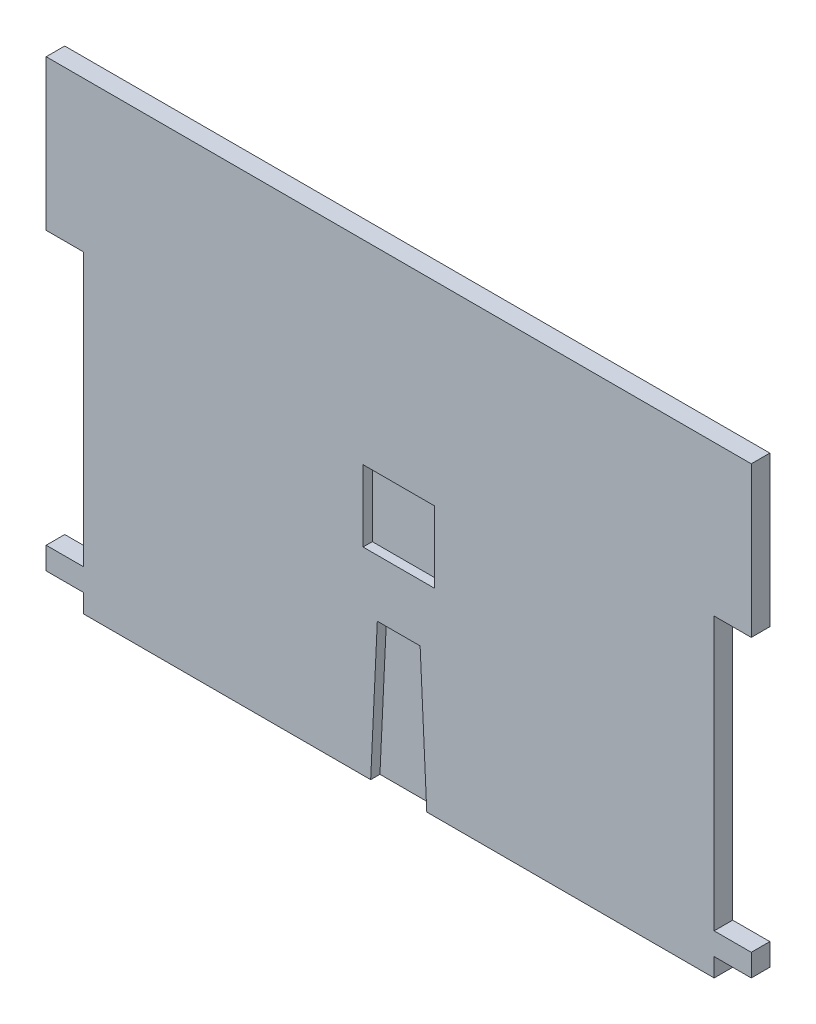
ISO-10303-21;
HEADER;
FILE_DESCRIPTION(('STEP AP214'),'2;1');
FILE_NAME('part.step','',(''),(''),'','','');
FILE_SCHEMA(('AUTOMOTIVE_DESIGN { 1 0 10303 214 1 1 1 1 }'));
ENDSEC;
DATA;
#1=APPLICATION_CONTEXT('core data for automotive mechanical design processes');
#2=APPLICATION_PROTOCOL_DEFINITION('international standard','automotive_design',2000,#1);
#3=PRODUCT_CONTEXT('',#1,'mechanical');
#4=PRODUCT('Part','Part','',(#3));
#5=PRODUCT_RELATED_PRODUCT_CATEGORY('part','',(#4));
#6=PRODUCT_DEFINITION_FORMATION('','',#4);
#7=PRODUCT_DEFINITION_CONTEXT('part definition',#1,'design');
#8=PRODUCT_DEFINITION('design','',#6,#7);
#9=PRODUCT_DEFINITION_SHAPE('','',#8);
#10=(LENGTH_UNIT() NAMED_UNIT(*) SI_UNIT(.MILLI.,.METRE.));
#11=(NAMED_UNIT(*) PLANE_ANGLE_UNIT() SI_UNIT($,.RADIAN.));
#12=(NAMED_UNIT(*) SI_UNIT($,.STERADIAN.) SOLID_ANGLE_UNIT());
#13=UNCERTAINTY_MEASURE_WITH_UNIT(LENGTH_MEASURE(1.E-05),#10,'distance_accuracy_value','');
#14=(GEOMETRIC_REPRESENTATION_CONTEXT(3) GLOBAL_UNCERTAINTY_ASSIGNED_CONTEXT((#13)) GLOBAL_UNIT_ASSIGNED_CONTEXT((#10,
#11,#12)) REPRESENTATION_CONTEXT('',''));
#15=CARTESIAN_POINT('',(0.,0.,0.));
#16=DIRECTION('',(0.,0.,1.));
#17=DIRECTION('',(1.,0.,0.));
#18=AXIS2_PLACEMENT_3D('',#15,#16,#17);
#19=CARTESIAN_POINT('',(-17.,0.5,1.));
#20=DIRECTION('',(0.,1.,0.));
#21=DIRECTION('',(0.,0.,1.));
#22=AXIS2_PLACEMENT_3D('',#19,#20,#21);
#23=PLANE('',#22);
#24=DIRECTION('',(0.,0.,1.));
#25=VECTOR('',#24,1.);
#26=CARTESIAN_POINT('',(1.51198727417339,0.5,1.));
#27=LINE('',#26,#25);
#28=CARTESIAN_POINT('',(1.51198727417339,0.5,0.5));
#29=VERTEX_POINT('',#28);
#30=CARTESIAN_POINT('',(1.51198727417339,0.5,1.));
#31=VERTEX_POINT('',#30);
#32=EDGE_CURVE('E11',#29,#31,#27,.T.);
#33=ORIENTED_EDGE('',*,*,#32,.F.);
#34=DIRECTION('',(-1.,0.,0.));
#35=VECTOR('',#34,1.);
#36=CARTESIAN_POINT('',(-17.,0.5,0.5));
#37=LINE('',#36,#35);
#38=CARTESIAN_POINT('',(-1.51198727417339,0.5,0.5));
#39=VERTEX_POINT('',#38);
#40=EDGE_CURVE('E223',#29,#39,#37,.T.);
#41=ORIENTED_EDGE('',*,*,#40,.T.);
#42=DIRECTION('',(0.,0.,-1.));
#43=VECTOR('',#42,1.);
#44=CARTESIAN_POINT('',(-1.51198727417339,0.5,1.));
#45=LINE('',#44,#43);
#46=CARTESIAN_POINT('',(-1.51198727417339,0.5,1.));
#47=VERTEX_POINT('',#46);
#48=EDGE_CURVE('E47',#47,#39,#45,.T.);
#49=ORIENTED_EDGE('',*,*,#48,.F.);
#50=DIRECTION('',(1.,0.,0.));
#51=VECTOR('',#50,1.);
#52=CARTESIAN_POINT('',(-17.,0.5,1.));
#53=LINE('',#52,#51);
#54=CARTESIAN_POINT('',(-17.,0.5,1.));
#55=VERTEX_POINT('',#54);
#56=EDGE_CURVE('E200',#55,#47,#53,.T.);
#57=ORIENTED_EDGE('',*,*,#56,.F.);
#58=DIRECTION('',(0.,0.,-1.));
#59=VECTOR('',#58,1.);
#60=CARTESIAN_POINT('',(-17.,0.5,1.));
#61=LINE('',#60,#59);
#62=CARTESIAN_POINT('',(-17.,0.5,0.));
#63=VERTEX_POINT('',#62);
#64=EDGE_CURVE('E229',#55,#63,#61,.T.);
#65=ORIENTED_EDGE('',*,*,#64,.T.);
#66=DIRECTION('',(1.,0.,0.));
#67=VECTOR('',#66,1.);
#68=CARTESIAN_POINT('',(-17.,0.5,0.));
#69=LINE('',#68,#67);
#70=CARTESIAN_POINT('',(17.,0.5,0.));
#71=VERTEX_POINT('',#70);
#72=EDGE_CURVE('E269',#63,#71,#69,.T.);
#73=ORIENTED_EDGE('',*,*,#72,.T.);
#74=DIRECTION('',(0.,0.,-1.));
#75=VECTOR('',#74,1.);
#76=CARTESIAN_POINT('',(17.,0.5,1.));
#77=LINE('',#76,#75);
#78=CARTESIAN_POINT('',(17.,0.5,1.));
#79=VERTEX_POINT('',#78);
#80=EDGE_CURVE('E232',#79,#71,#77,.T.);
#81=ORIENTED_EDGE('',*,*,#80,.F.);
#82=EDGE_CURVE('E189',#31,#79,#53,.T.);
#83=ORIENTED_EDGE('',*,*,#82,.F.);
#84=EDGE_LOOP('',(#33,#41,#49,#57,#65,#73,#81,#83));
#85=FACE_BOUND('',#84,.T.);
#86=ADVANCED_FACE('F39',(#85),#23,.F.);
#87=CARTESIAN_POINT('',(0.,0.,1.));
#88=DIRECTION('',(0.,0.,-1.));
#89=DIRECTION('',(-1.,0.,0.));
#90=AXIS2_PLACEMENT_3D('',#87,#88,#89);
#91=PLANE('',#90);
#92=ORIENTED_EDGE('',*,*,#56,.T.);
#93=DIRECTION('',(0.0472146418634893,0.998884766924445,0.));
#94=VECTOR('',#93,1.);
#95=CARTESIAN_POINT('',(-1.92307692307693,-8.19711538461539,1.));
#96=LINE('',#95,#94);
#97=CARTESIAN_POINT('',(-1.15384615384616,8.07692307692307,1.));
#98=VERTEX_POINT('',#97);
#99=EDGE_CURVE('E226',#47,#98,#96,.T.);
#100=ORIENTED_EDGE('',*,*,#99,.T.);
#101=DIRECTION('',(1.,0.,0.));
#102=VECTOR('',#101,1.);
#103=CARTESIAN_POINT('',(-1.15384615384616,8.07692307692307,1.));
#104=LINE('',#103,#102);
#105=CARTESIAN_POINT('',(1.15384615384615,8.07692307692307,1.));
#106=VERTEX_POINT('',#105);
#107=EDGE_CURVE('E329',#98,#106,#104,.T.);
#108=ORIENTED_EDGE('',*,*,#107,.T.);
#109=DIRECTION('',(0.0472146418634893,-0.998884766924445,0.));
#110=VECTOR('',#109,1.);
#111=CARTESIAN_POINT('',(1.15384615384615,8.07692307692307,1.));
#112=LINE('',#111,#110);
#113=EDGE_CURVE('E486',#106,#31,#112,.T.);
#114=ORIENTED_EDGE('',*,*,#113,.T.);
#115=ORIENTED_EDGE('',*,*,#82,.T.);
#116=DIRECTION('',(0.,1.,0.));
#117=VECTOR('',#116,1.);
#118=CARTESIAN_POINT('',(17.,0.5,1.));
#119=LINE('',#118,#117);
#120=CARTESIAN_POINT('',(17.,1.5,1.));
#121=VERTEX_POINT('',#120);
#122=EDGE_CURVE('E198',#79,#121,#119,.T.);
#123=ORIENTED_EDGE('',*,*,#122,.T.);
#124=DIRECTION('',(1.,0.,0.));
#125=VECTOR('',#124,1.);
#126=CARTESIAN_POINT('',(17.,1.5,1.));
#127=LINE('',#126,#125);
#128=CARTESIAN_POINT('',(19.,1.5,1.));
#129=VERTEX_POINT('',#128);
#130=EDGE_CURVE('E205',#121,#129,#127,.T.);
#131=ORIENTED_EDGE('',*,*,#130,.T.);
#132=DIRECTION('',(0.,1.,0.));
#133=VECTOR('',#132,1.);
#134=CARTESIAN_POINT('',(19.,1.5,1.));
#135=LINE('',#134,#133);
#136=CARTESIAN_POINT('',(19.,2.7,1.));
#137=VERTEX_POINT('',#136);
#138=EDGE_CURVE('E204',#129,#137,#135,.T.);
#139=ORIENTED_EDGE('',*,*,#138,.T.);
#140=DIRECTION('',(-1.,0.,0.));
#141=VECTOR('',#140,1.);
#142=CARTESIAN_POINT('',(19.,2.7,1.));
#143=LINE('',#142,#141);
#144=CARTESIAN_POINT('',(17.,2.7,1.));
#145=VERTEX_POINT('',#144);
#146=EDGE_CURVE('E207',#137,#145,#143,.T.);
#147=ORIENTED_EDGE('',*,*,#146,.T.);
#148=DIRECTION('',(0.,1.,0.));
#149=VECTOR('',#148,1.);
#150=CARTESIAN_POINT('',(17.,2.7,1.));
#151=LINE('',#150,#149);
#152=CARTESIAN_POINT('',(17.,17.3947217067352,1.));
#153=VERTEX_POINT('',#152);
#154=EDGE_CURVE('E210',#145,#153,#151,.T.);
#155=ORIENTED_EDGE('',*,*,#154,.T.);
#156=DIRECTION('',(1.,0.,0.));
#157=VECTOR('',#156,1.);
#158=CARTESIAN_POINT('',(17.,17.3947217067352,1.));
#159=LINE('',#158,#157);
#160=CARTESIAN_POINT('',(19.,17.3947217067352,1.));
#161=VERTEX_POINT('',#160);
#162=EDGE_CURVE('E208',#153,#161,#159,.T.);
#163=ORIENTED_EDGE('',*,*,#162,.T.);
#164=DIRECTION('',(0.,1.,0.));
#165=VECTOR('',#164,1.);
#166=CARTESIAN_POINT('',(19.,17.3947217067352,1.));
#167=LINE('',#166,#165);
#168=CARTESIAN_POINT('',(19.,25.5,1.));
#169=VERTEX_POINT('',#168);
#170=EDGE_CURVE('E212',#161,#169,#167,.T.);
#171=ORIENTED_EDGE('',*,*,#170,.T.);
#172=DIRECTION('',(-1.,0.,0.));
#173=VECTOR('',#172,1.);
#174=CARTESIAN_POINT('',(19.,25.5,1.));
#175=LINE('',#174,#173);
#176=CARTESIAN_POINT('',(-19.,25.5,1.));
#177=VERTEX_POINT('',#176);
#178=EDGE_CURVE('E215',#169,#177,#175,.T.);
#179=ORIENTED_EDGE('',*,*,#178,.T.);
#180=DIRECTION('',(0.,-1.,0.));
#181=VECTOR('',#180,1.);
#182=CARTESIAN_POINT('',(-19.,25.5,1.));
#183=LINE('',#182,#181);
#184=CARTESIAN_POINT('',(-19.,17.3947217067352,1.));
#185=VERTEX_POINT('',#184);
#186=EDGE_CURVE('E218',#177,#185,#183,.T.);
#187=ORIENTED_EDGE('',*,*,#186,.T.);
#188=DIRECTION('',(1.,0.,0.));
#189=VECTOR('',#188,1.);
#190=CARTESIAN_POINT('',(-19.,17.3947217067352,1.));
#191=LINE('',#190,#189);
#192=CARTESIAN_POINT('',(-17.,17.3947217067352,1.));
#193=VERTEX_POINT('',#192);
#194=EDGE_CURVE('E216',#185,#193,#191,.T.);
#195=ORIENTED_EDGE('',*,*,#194,.T.);
#196=DIRECTION('',(0.,-1.,0.));
#197=VECTOR('',#196,1.);
#198=CARTESIAN_POINT('',(-17.,17.3947217067352,1.));
#199=LINE('',#198,#197);
#200=CARTESIAN_POINT('',(-17.,2.7,1.));
#201=VERTEX_POINT('',#200);
#202=EDGE_CURVE('E217',#193,#201,#199,.T.);
#203=ORIENTED_EDGE('',*,*,#202,.T.);
#204=DIRECTION('',(-1.,0.,0.));
#205=VECTOR('',#204,1.);
#206=CARTESIAN_POINT('',(-17.,2.7,1.));
#207=LINE('',#206,#205);
#208=CARTESIAN_POINT('',(-19.,2.7,1.));
#209=VERTEX_POINT('',#208);
#210=EDGE_CURVE('E178',#201,#209,#207,.T.);
#211=ORIENTED_EDGE('',*,*,#210,.T.);
#212=DIRECTION('',(0.,-1.,0.));
#213=VECTOR('',#212,1.);
#214=CARTESIAN_POINT('',(-19.,2.7,1.));
#215=LINE('',#214,#213);
#216=CARTESIAN_POINT('',(-19.,1.5,1.));
#217=VERTEX_POINT('',#216);
#218=EDGE_CURVE('E169',#209,#217,#215,.T.);
#219=ORIENTED_EDGE('',*,*,#218,.T.);
#220=DIRECTION('',(1.,0.,0.));
#221=VECTOR('',#220,1.);
#222=CARTESIAN_POINT('',(-19.,1.5,1.));
#223=LINE('',#222,#221);
#224=CARTESIAN_POINT('',(-17.,1.5,1.));
#225=VERTEX_POINT('',#224);
#226=EDGE_CURVE('E172',#217,#225,#223,.T.);
#227=ORIENTED_EDGE('',*,*,#226,.T.);
#228=DIRECTION('',(0.,-1.,0.));
#229=VECTOR('',#228,1.);
#230=CARTESIAN_POINT('',(-17.,1.5,1.));
#231=LINE('',#230,#229);
#232=EDGE_CURVE('E122',#225,#55,#231,.T.);
#233=ORIENTED_EDGE('',*,*,#232,.T.);
#234=EDGE_LOOP('',(#92,#100,#108,#114,#115,#123,#131,#139,#147,#155,#163,#171,#179,#187,#195,
#203,#211,#219,#227,#233));
#235=FACE_BOUND('',#234,.T.);
#236=DIRECTION('',(1.,0.,0.));
#237=VECTOR('',#236,1.);
#238=CARTESIAN_POINT('',(-1.92307692307693,15.,1.));
#239=LINE('',#238,#237);
#240=CARTESIAN_POINT('',(-1.92307692307693,15.,1.));
#241=VERTEX_POINT('',#240);
#242=CARTESIAN_POINT('',(1.92307692307692,15.,1.));
#243=VERTEX_POINT('',#242);
#244=EDGE_CURVE('E324',#241,#243,#239,.T.);
#245=ORIENTED_EDGE('',*,*,#244,.T.);
#246=DIRECTION('',(0.,-1.,0.));
#247=VECTOR('',#246,1.);
#248=CARTESIAN_POINT('',(1.92307692307692,15.,1.));
#249=LINE('',#248,#247);
#250=CARTESIAN_POINT('',(1.92307692307692,11.1538461538462,1.));
#251=VERTEX_POINT('',#250);
#252=EDGE_CURVE('E325',#243,#251,#249,.T.);
#253=ORIENTED_EDGE('',*,*,#252,.T.);
#254=DIRECTION('',(-1.,0.,0.));
#255=VECTOR('',#254,1.);
#256=CARTESIAN_POINT('',(1.92307692307692,11.1538461538462,1.));
#257=LINE('',#256,#255);
#258=CARTESIAN_POINT('',(-1.92307692307693,11.1538461538462,1.));
#259=VERTEX_POINT('',#258);
#260=EDGE_CURVE('E317',#251,#259,#257,.T.);
#261=ORIENTED_EDGE('',*,*,#260,.T.);
#262=DIRECTION('',(0.,1.,0.));
#263=VECTOR('',#262,1.);
#264=CARTESIAN_POINT('',(-1.92307692307693,11.1538461538462,1.));
#265=LINE('',#264,#263);
#266=EDGE_CURVE('E316',#259,#241,#265,.T.);
#267=ORIENTED_EDGE('',*,*,#266,.T.);
#268=EDGE_LOOP('',(#245,#253,#261,#267));
#269=FACE_BOUND('',#268,.T.);
#270=ADVANCED_FACE('F175',(#235,#269),#91,.F.);
#271=CARTESIAN_POINT('',(-19.,1.5,1.));
#272=DIRECTION('',(0.,1.,0.));
#273=DIRECTION('',(-1.,0.,0.));
#274=AXIS2_PLACEMENT_3D('',#271,#272,#273);
#275=PLANE('',#274);
#276=DIRECTION('',(-1.,0.,0.));
#277=VECTOR('',#276,1.);
#278=CARTESIAN_POINT('',(-19.,1.5,0.));
#279=LINE('',#278,#277);
#280=CARTESIAN_POINT('',(-19.,1.5,0.));
#281=VERTEX_POINT('',#280);
#282=CARTESIAN_POINT('',(-17.,1.5,0.));
#283=VERTEX_POINT('',#282);
#284=EDGE_CURVE('E43',#281,#283,#279,.F.);
#285=ORIENTED_EDGE('',*,*,#284,.T.);
#286=DIRECTION('',(0.,0.,-1.));
#287=VECTOR('',#286,1.);
#288=CARTESIAN_POINT('',(-17.,1.5,1.));
#289=LINE('',#288,#287);
#290=EDGE_CURVE('E187',#225,#283,#289,.T.);
#291=ORIENTED_EDGE('',*,*,#290,.F.);
#292=ORIENTED_EDGE('',*,*,#226,.F.);
#293=DIRECTION('',(0.,0.,-1.));
#294=VECTOR('',#293,1.);
#295=CARTESIAN_POINT('',(-19.,1.5,1.));
#296=LINE('',#295,#294);
#297=EDGE_CURVE('E179',#217,#281,#296,.T.);
#298=ORIENTED_EDGE('',*,*,#297,.T.);
#299=EDGE_LOOP('',(#285,#291,#292,#298));
#300=FACE_BOUND('',#299,.T.);
#301=ADVANCED_FACE('F41',(#300),#275,.F.);
#302=CARTESIAN_POINT('',(-17.,1.5,1.));
#303=DIRECTION('',(1.,0.,0.));
#304=DIRECTION('',(0.,0.,-1.));
#305=AXIS2_PLACEMENT_3D('',#302,#303,#304);
#306=PLANE('',#305);
#307=DIRECTION('',(0.,1.,0.));
#308=VECTOR('',#307,1.);
#309=CARTESIAN_POINT('',(-17.,1.5,0.));
#310=LINE('',#309,#308);
#311=EDGE_CURVE('E275',#283,#63,#310,.F.);
#312=ORIENTED_EDGE('',*,*,#311,.T.);
#313=ORIENTED_EDGE('',*,*,#64,.F.);
#314=ORIENTED_EDGE('',*,*,#232,.F.);
#315=ORIENTED_EDGE('',*,*,#290,.T.);
#316=EDGE_LOOP('',(#312,#313,#314,#315));
#317=FACE_BOUND('',#316,.T.);
#318=ADVANCED_FACE('F384',(#317),#306,.F.);
#319=CARTESIAN_POINT('',(17.,0.5,1.));
#320=DIRECTION('',(-1.,0.,0.));
#321=DIRECTION('',(0.,0.,1.));
#322=AXIS2_PLACEMENT_3D('',#319,#320,#321);
#323=PLANE('',#322);
#324=DIRECTION('',(0.,1.,0.));
#325=VECTOR('',#324,1.);
#326=CARTESIAN_POINT('',(17.,0.5,0.));
#327=LINE('',#326,#325);
#328=CARTESIAN_POINT('',(17.,1.5,0.));
#329=VERTEX_POINT('',#328);
#330=EDGE_CURVE('E271',#71,#329,#327,.T.);
#331=ORIENTED_EDGE('',*,*,#330,.T.);
#332=DIRECTION('',(0.,0.,-1.));
#333=VECTOR('',#332,1.);
#334=CARTESIAN_POINT('',(17.,1.5,1.));
#335=LINE('',#334,#333);
#336=EDGE_CURVE('E237',#121,#329,#335,.T.);
#337=ORIENTED_EDGE('',*,*,#336,.F.);
#338=ORIENTED_EDGE('',*,*,#122,.F.);
#339=ORIENTED_EDGE('',*,*,#80,.T.);
#340=EDGE_LOOP('',(#331,#337,#338,#339));
#341=FACE_BOUND('',#340,.T.);
#342=ADVANCED_FACE('F387',(#341),#323,.F.);
#343=CARTESIAN_POINT('',(17.,1.5,1.));
#344=DIRECTION('',(0.,1.,0.));
#345=DIRECTION('',(-1.,0.,0.));
#346=AXIS2_PLACEMENT_3D('',#343,#344,#345);
#347=PLANE('',#346);
#348=DIRECTION('',(-1.,0.,0.));
#349=VECTOR('',#348,1.);
#350=CARTESIAN_POINT('',(17.,1.5,0.));
#351=LINE('',#350,#349);
#352=CARTESIAN_POINT('',(19.,1.5,0.));
#353=VERTEX_POINT('',#352);
#354=EDGE_CURVE('E291',#329,#353,#351,.F.);
#355=ORIENTED_EDGE('',*,*,#354,.T.);
#356=DIRECTION('',(0.,0.,-1.));
#357=VECTOR('',#356,1.);
#358=CARTESIAN_POINT('',(19.,1.5,1.));
#359=LINE('',#358,#357);
#360=EDGE_CURVE('E236',#129,#353,#359,.T.);
#361=ORIENTED_EDGE('',*,*,#360,.F.);
#362=ORIENTED_EDGE('',*,*,#130,.F.);
#363=ORIENTED_EDGE('',*,*,#336,.T.);
#364=EDGE_LOOP('',(#355,#361,#362,#363));
#365=FACE_BOUND('',#364,.T.);
#366=ADVANCED_FACE('F393',(#365),#347,.F.);
#367=CARTESIAN_POINT('',(19.,1.5,1.));
#368=DIRECTION('',(-1.,0.,0.));
#369=DIRECTION('',(0.,0.,1.));
#370=AXIS2_PLACEMENT_3D('',#367,#368,#369);
#371=PLANE('',#370);
#372=DIRECTION('',(0.,1.,0.));
#373=VECTOR('',#372,1.);
#374=CARTESIAN_POINT('',(19.,1.5,0.));
#375=LINE('',#374,#373);
#376=CARTESIAN_POINT('',(19.,2.7,0.));
#377=VERTEX_POINT('',#376);
#378=EDGE_CURVE('E292',#353,#377,#375,.T.);
#379=ORIENTED_EDGE('',*,*,#378,.T.);
#380=DIRECTION('',(0.,0.,-1.));
#381=VECTOR('',#380,1.);
#382=CARTESIAN_POINT('',(19.,2.7,1.));
#383=LINE('',#382,#381);
#384=EDGE_CURVE('E244',#137,#377,#383,.T.);
#385=ORIENTED_EDGE('',*,*,#384,.F.);
#386=ORIENTED_EDGE('',*,*,#138,.F.);
#387=ORIENTED_EDGE('',*,*,#360,.T.);
#388=EDGE_LOOP('',(#379,#385,#386,#387));
#389=FACE_BOUND('',#388,.T.);
#390=ADVANCED_FACE('F406',(#389),#371,.F.);
#391=CARTESIAN_POINT('',(19.,2.7,1.));
#392=DIRECTION('',(0.,-1.,0.));
#393=DIRECTION('',(0.,0.,-1.));
#394=AXIS2_PLACEMENT_3D('',#391,#392,#393);
#395=PLANE('',#394);
#396=DIRECTION('',(1.,0.,0.));
#397=VECTOR('',#396,1.);
#398=CARTESIAN_POINT('',(19.,2.7,0.));
#399=LINE('',#398,#397);
#400=CARTESIAN_POINT('',(17.,2.7,0.));
#401=VERTEX_POINT('',#400);
#402=EDGE_CURVE('E286',#377,#401,#399,.F.);
#403=ORIENTED_EDGE('',*,*,#402,.T.);
#404=DIRECTION('',(0.,0.,-1.));
#405=VECTOR('',#404,1.);
#406=CARTESIAN_POINT('',(17.,2.7,1.));
#407=LINE('',#406,#405);
#408=EDGE_CURVE('E243',#145,#401,#407,.T.);
#409=ORIENTED_EDGE('',*,*,#408,.F.);
#410=ORIENTED_EDGE('',*,*,#146,.F.);
#411=ORIENTED_EDGE('',*,*,#384,.T.);
#412=EDGE_LOOP('',(#403,#409,#410,#411));
#413=FACE_BOUND('',#412,.T.);
#414=ADVANCED_FACE('F409',(#413),#395,.F.);
#415=CARTESIAN_POINT('',(17.,2.7,1.));
#416=DIRECTION('',(-1.,0.,0.));
#417=DIRECTION('',(0.,0.,1.));
#418=AXIS2_PLACEMENT_3D('',#415,#416,#417);
#419=PLANE('',#418);
#420=DIRECTION('',(0.,1.,0.));
#421=VECTOR('',#420,1.);
#422=CARTESIAN_POINT('',(17.,2.7,0.));
#423=LINE('',#422,#421);
#424=CARTESIAN_POINT('',(17.,17.3947217067352,0.));
#425=VERTEX_POINT('',#424);
#426=EDGE_CURVE('E289',#401,#425,#423,.T.);
#427=ORIENTED_EDGE('',*,*,#426,.T.);
#428=DIRECTION('',(0.,0.,-1.));
#429=VECTOR('',#428,1.);
#430=CARTESIAN_POINT('',(17.,17.3947217067352,1.));
#431=LINE('',#430,#429);
#432=EDGE_CURVE('E246',#153,#425,#431,.T.);
#433=ORIENTED_EDGE('',*,*,#432,.F.);
#434=ORIENTED_EDGE('',*,*,#154,.F.);
#435=ORIENTED_EDGE('',*,*,#408,.T.);
#436=EDGE_LOOP('',(#427,#433,#434,#435));
#437=FACE_BOUND('',#436,.T.);
#438=ADVANCED_FACE('F413',(#437),#419,.F.);
#439=CARTESIAN_POINT('',(17.,17.3947217067352,1.));
#440=DIRECTION('',(0.,1.,0.));
#441=DIRECTION('',(0.,0.,1.));
#442=AXIS2_PLACEMENT_3D('',#439,#440,#441);
#443=PLANE('',#442);
#444=DIRECTION('',(1.,0.,0.));
#445=VECTOR('',#444,1.);
#446=CARTESIAN_POINT('',(17.,17.3947217067352,0.));
#447=LINE('',#446,#445);
#448=CARTESIAN_POINT('',(19.,17.3947217067352,0.));
#449=VERTEX_POINT('',#448);
#450=EDGE_CURVE('E283',#425,#449,#447,.T.);
#451=ORIENTED_EDGE('',*,*,#450,.T.);
#452=DIRECTION('',(0.,0.,-1.));
#453=VECTOR('',#452,1.);
#454=CARTESIAN_POINT('',(19.,17.3947217067352,1.));
#455=LINE('',#454,#453);
#456=EDGE_CURVE('E252',#161,#449,#455,.T.);
#457=ORIENTED_EDGE('',*,*,#456,.F.);
#458=ORIENTED_EDGE('',*,*,#162,.F.);
#459=ORIENTED_EDGE('',*,*,#432,.T.);
#460=EDGE_LOOP('',(#451,#457,#458,#459));
#461=FACE_BOUND('',#460,.T.);
#462=ADVANCED_FACE('F419',(#461),#443,.F.);
#463=CARTESIAN_POINT('',(19.,17.3947217067352,1.));
#464=DIRECTION('',(-1.,0.,0.));
#465=DIRECTION('',(0.,0.,1.));
#466=AXIS2_PLACEMENT_3D('',#463,#464,#465);
#467=PLANE('',#466);
#468=DIRECTION('',(0.,1.,0.));
#469=VECTOR('',#468,1.);
#470=CARTESIAN_POINT('',(19.,17.3947217067352,0.));
#471=LINE('',#470,#469);
#472=CARTESIAN_POINT('',(19.,25.5,0.));
#473=VERTEX_POINT('',#472);
#474=EDGE_CURVE('E284',#449,#473,#471,.T.);
#475=ORIENTED_EDGE('',*,*,#474,.T.);
#476=DIRECTION('',(0.,0.,-1.));
#477=VECTOR('',#476,1.);
#478=CARTESIAN_POINT('',(19.,25.5,1.));
#479=LINE('',#478,#477);
#480=EDGE_CURVE('E251',#169,#473,#479,.T.);
#481=ORIENTED_EDGE('',*,*,#480,.F.);
#482=ORIENTED_EDGE('',*,*,#170,.F.);
#483=ORIENTED_EDGE('',*,*,#456,.T.);
#484=EDGE_LOOP('',(#475,#481,#482,#483));
#485=FACE_BOUND('',#484,.T.);
#486=ADVANCED_FACE('F424',(#485),#467,.F.);
#487=CARTESIAN_POINT('',(19.,25.5,1.));
#488=DIRECTION('',(0.,-1.,0.));
#489=DIRECTION('',(0.,0.,-1.));
#490=AXIS2_PLACEMENT_3D('',#487,#488,#489);
#491=PLANE('',#490);
#492=DIRECTION('',(1.,0.,0.));
#493=VECTOR('',#492,1.);
#494=CARTESIAN_POINT('',(19.,25.5,0.));
#495=LINE('',#494,#493);
#496=CARTESIAN_POINT('',(-19.,25.5,0.));
#497=VERTEX_POINT('',#496);
#498=EDGE_CURVE('E282',#473,#497,#495,.F.);
#499=ORIENTED_EDGE('',*,*,#498,.T.);
#500=DIRECTION('',(0.,0.,-1.));
#501=VECTOR('',#500,1.);
#502=CARTESIAN_POINT('',(-19.,25.5,1.));
#503=LINE('',#502,#501);
#504=EDGE_CURVE('E257',#177,#497,#503,.T.);
#505=ORIENTED_EDGE('',*,*,#504,.F.);
#506=ORIENTED_EDGE('',*,*,#178,.F.);
#507=ORIENTED_EDGE('',*,*,#480,.T.);
#508=EDGE_LOOP('',(#499,#505,#506,#507));
#509=FACE_BOUND('',#508,.T.);
#510=ADVANCED_FACE('F427',(#509),#491,.F.);
#511=CARTESIAN_POINT('',(-19.,25.5,1.));
#512=DIRECTION('',(1.,0.,0.));
#513=DIRECTION('',(0.,0.,-1.));
#514=AXIS2_PLACEMENT_3D('',#511,#512,#513);
#515=PLANE('',#514);
#516=DIRECTION('',(0.,1.,0.));
#517=VECTOR('',#516,1.);
#518=CARTESIAN_POINT('',(-19.,25.5,0.));
#519=LINE('',#518,#517);
#520=CARTESIAN_POINT('',(-19.,17.3947217067352,0.));
#521=VERTEX_POINT('',#520);
#522=EDGE_CURVE('E278',#497,#521,#519,.F.);
#523=ORIENTED_EDGE('',*,*,#522,.T.);
#524=DIRECTION('',(0.,0.,-1.));
#525=VECTOR('',#524,1.);
#526=CARTESIAN_POINT('',(-19.,17.3947217067352,1.));
#527=LINE('',#526,#525);
#528=EDGE_CURVE('E259',#185,#521,#527,.T.);
#529=ORIENTED_EDGE('',*,*,#528,.F.);
#530=ORIENTED_EDGE('',*,*,#186,.F.);
#531=ORIENTED_EDGE('',*,*,#504,.T.);
#532=EDGE_LOOP('',(#523,#529,#530,#531));
#533=FACE_BOUND('',#532,.T.);
#534=ADVANCED_FACE('F428',(#533),#515,.F.);
#535=CARTESIAN_POINT('',(-19.,17.3947217067352,1.));
#536=DIRECTION('',(0.,1.,0.));
#537=DIRECTION('',(0.,0.,1.));
#538=AXIS2_PLACEMENT_3D('',#535,#536,#537);
#539=PLANE('',#538);
#540=DIRECTION('',(1.,0.,0.));
#541=VECTOR('',#540,1.);
#542=CARTESIAN_POINT('',(-19.,17.3947217067352,0.));
#543=LINE('',#542,#541);
#544=CARTESIAN_POINT('',(-17.,17.3947217067352,0.));
#545=VERTEX_POINT('',#544);
#546=EDGE_CURVE('E280',#521,#545,#543,.T.);
#547=ORIENTED_EDGE('',*,*,#546,.T.);
#548=DIRECTION('',(0.,0.,-1.));
#549=VECTOR('',#548,1.);
#550=CARTESIAN_POINT('',(-17.,17.3947217067352,1.));
#551=LINE('',#550,#549);
#552=EDGE_CURVE('E261',#193,#545,#551,.T.);
#553=ORIENTED_EDGE('',*,*,#552,.F.);
#554=ORIENTED_EDGE('',*,*,#194,.F.);
#555=ORIENTED_EDGE('',*,*,#528,.T.);
#556=EDGE_LOOP('',(#547,#553,#554,#555));
#557=FACE_BOUND('',#556,.T.);
#558=ADVANCED_FACE('F431',(#557),#539,.F.);
#559=CARTESIAN_POINT('',(-17.,17.3947217067352,1.));
#560=DIRECTION('',(1.,0.,0.));
#561=DIRECTION('',(0.,0.,-1.));
#562=AXIS2_PLACEMENT_3D('',#559,#560,#561);
#563=PLANE('',#562);
#564=DIRECTION('',(0.,1.,0.));
#565=VECTOR('',#564,1.);
#566=CARTESIAN_POINT('',(-17.,17.3947217067352,0.));
#567=LINE('',#566,#565);
#568=CARTESIAN_POINT('',(-17.,2.7,0.));
#569=VERTEX_POINT('',#568);
#570=EDGE_CURVE('E274',#545,#569,#567,.F.);
#571=ORIENTED_EDGE('',*,*,#570,.T.);
#572=DIRECTION('',(0.,0.,-1.));
#573=VECTOR('',#572,1.);
#574=CARTESIAN_POINT('',(-17.,2.7,1.));
#575=LINE('',#574,#573);
#576=EDGE_CURVE('E266',#201,#569,#575,.T.);
#577=ORIENTED_EDGE('',*,*,#576,.F.);
#578=ORIENTED_EDGE('',*,*,#202,.F.);
#579=ORIENTED_EDGE('',*,*,#552,.T.);
#580=EDGE_LOOP('',(#571,#577,#578,#579));
#581=FACE_BOUND('',#580,.T.);
#582=ADVANCED_FACE('F436',(#581),#563,.F.);
#583=CARTESIAN_POINT('',(-17.,2.7,1.));
#584=DIRECTION('',(0.,-1.,0.));
#585=DIRECTION('',(0.,0.,-1.));
#586=AXIS2_PLACEMENT_3D('',#583,#584,#585);
#587=PLANE('',#586);
#588=DIRECTION('',(1.,0.,0.));
#589=VECTOR('',#588,1.);
#590=CARTESIAN_POINT('',(-17.,2.7,0.));
#591=LINE('',#590,#589);
#592=CARTESIAN_POINT('',(-19.,2.7,0.));
#593=VERTEX_POINT('',#592);
#594=EDGE_CURVE('E195',#569,#593,#591,.F.);
#595=ORIENTED_EDGE('',*,*,#594,.T.);
#596=DIRECTION('',(0.,0.,-1.));
#597=VECTOR('',#596,1.);
#598=CARTESIAN_POINT('',(-19.,2.7,1.));
#599=LINE('',#598,#597);
#600=EDGE_CURVE('E186',#209,#593,#599,.T.);
#601=ORIENTED_EDGE('',*,*,#600,.F.);
#602=ORIENTED_EDGE('',*,*,#210,.F.);
#603=ORIENTED_EDGE('',*,*,#576,.T.);
#604=EDGE_LOOP('',(#595,#601,#602,#603));
#605=FACE_BOUND('',#604,.T.);
#606=ADVANCED_FACE('F445',(#605),#587,.F.);
#607=CARTESIAN_POINT('',(-19.,2.7,1.));
#608=DIRECTION('',(1.,0.,0.));
#609=DIRECTION('',(0.,0.,-1.));
#610=AXIS2_PLACEMENT_3D('',#607,#608,#609);
#611=PLANE('',#610);
#612=DIRECTION('',(0.,1.,0.));
#613=VECTOR('',#612,1.);
#614=CARTESIAN_POINT('',(-19.,2.7,0.));
#615=LINE('',#614,#613);
#616=EDGE_CURVE('E111',#593,#281,#615,.F.);
#617=ORIENTED_EDGE('',*,*,#616,.T.);
#618=ORIENTED_EDGE('',*,*,#297,.F.);
#619=ORIENTED_EDGE('',*,*,#218,.F.);
#620=ORIENTED_EDGE('',*,*,#600,.T.);
#621=EDGE_LOOP('',(#617,#618,#619,#620));
#622=FACE_BOUND('',#621,.T.);
#623=ADVANCED_FACE('F185',(#622),#611,.F.);
#624=CARTESIAN_POINT('',(0.,0.,0.));
#625=DIRECTION('',(0.,0.,-1.));
#626=DIRECTION('',(-1.,0.,0.));
#627=AXIS2_PLACEMENT_3D('',#624,#625,#626);
#628=PLANE('',#627);
#629=ORIENTED_EDGE('',*,*,#284,.F.);
#630=ORIENTED_EDGE('',*,*,#616,.F.);
#631=ORIENTED_EDGE('',*,*,#594,.F.);
#632=ORIENTED_EDGE('',*,*,#570,.F.);
#633=ORIENTED_EDGE('',*,*,#546,.F.);
#634=ORIENTED_EDGE('',*,*,#522,.F.);
#635=ORIENTED_EDGE('',*,*,#498,.F.);
#636=ORIENTED_EDGE('',*,*,#474,.F.);
#637=ORIENTED_EDGE('',*,*,#450,.F.);
#638=ORIENTED_EDGE('',*,*,#426,.F.);
#639=ORIENTED_EDGE('',*,*,#402,.F.);
#640=ORIENTED_EDGE('',*,*,#378,.F.);
#641=ORIENTED_EDGE('',*,*,#354,.F.);
#642=ORIENTED_EDGE('',*,*,#330,.F.);
#643=ORIENTED_EDGE('',*,*,#72,.F.);
#644=ORIENTED_EDGE('',*,*,#311,.F.);
#645=EDGE_LOOP('',(#629,#630,#631,#632,#633,#634,#635,#636,#637,#638,#639,#640,#641,#642,#643,#644));
#646=FACE_BOUND('',#645,.T.);
#647=ADVANCED_FACE('F385',(#646),#628,.T.);
#648=CARTESIAN_POINT('',(-1.92307692307693,15.,0.5));
#649=DIRECTION('',(0.,-1.,0.));
#650=DIRECTION('',(0.,0.,-1.));
#651=AXIS2_PLACEMENT_3D('',#648,#649,#650);
#652=PLANE('',#651);
#653=ORIENTED_EDGE('',*,*,#244,.F.);
#654=DIRECTION('',(0.,0.,1.));
#655=VECTOR('',#654,1.);
#656=CARTESIAN_POINT('',(-1.92307692307693,15.,0.5));
#657=LINE('',#656,#655);
#658=CARTESIAN_POINT('',(-1.92307692307693,15.,0.5));
#659=VERTEX_POINT('',#658);
#660=EDGE_CURVE('E315',#659,#241,#657,.T.);
#661=ORIENTED_EDGE('',*,*,#660,.F.);
#662=DIRECTION('',(1.,0.,0.));
#663=VECTOR('',#662,1.);
#664=CARTESIAN_POINT('',(-1.92307692307693,15.,0.5));
#665=LINE('',#664,#663);
#666=CARTESIAN_POINT('',(1.92307692307692,15.,0.5));
#667=VERTEX_POINT('',#666);
#668=EDGE_CURVE('E193',#659,#667,#665,.T.);
#669=ORIENTED_EDGE('',*,*,#668,.T.);
#670=DIRECTION('',(0.,0.,1.));
#671=VECTOR('',#670,1.);
#672=CARTESIAN_POINT('',(1.92307692307692,15.,0.5));
#673=LINE('',#672,#671);
#674=EDGE_CURVE('E301',#667,#243,#673,.T.);
#675=ORIENTED_EDGE('',*,*,#674,.T.);
#676=EDGE_LOOP('',(#653,#661,#669,#675));
#677=FACE_BOUND('',#676,.T.);
#678=ADVANCED_FACE('F343',(#677),#652,.T.);
#679=CARTESIAN_POINT('',(1.92307692307692,15.,0.5));
#680=DIRECTION('',(-1.,0.,0.));
#681=DIRECTION('',(0.,0.,1.));
#682=AXIS2_PLACEMENT_3D('',#679,#680,#681);
#683=PLANE('',#682);
#684=ORIENTED_EDGE('',*,*,#252,.F.);
#685=ORIENTED_EDGE('',*,*,#674,.F.);
#686=DIRECTION('',(0.,-1.,0.));
#687=VECTOR('',#686,1.);
#688=CARTESIAN_POINT('',(1.92307692307692,15.,0.5));
#689=LINE('',#688,#687);
#690=CARTESIAN_POINT('',(1.92307692307692,11.1538461538462,0.5));
#691=VERTEX_POINT('',#690);
#692=EDGE_CURVE('E335',#667,#691,#689,.T.);
#693=ORIENTED_EDGE('',*,*,#692,.T.);
#694=DIRECTION('',(0.,0.,1.));
#695=VECTOR('',#694,1.);
#696=CARTESIAN_POINT('',(1.92307692307692,11.1538461538462,0.5));
#697=LINE('',#696,#695);
#698=EDGE_CURVE('E308',#691,#251,#697,.T.);
#699=ORIENTED_EDGE('',*,*,#698,.T.);
#700=EDGE_LOOP('',(#684,#685,#693,#699));
#701=FACE_BOUND('',#700,.T.);
#702=ADVANCED_FACE('F351',(#701),#683,.T.);
#703=CARTESIAN_POINT('',(1.92307692307692,11.1538461538462,0.5));
#704=DIRECTION('',(0.,1.,0.));
#705=DIRECTION('',(0.,0.,1.));
#706=AXIS2_PLACEMENT_3D('',#703,#704,#705);
#707=PLANE('',#706);
#708=ORIENTED_EDGE('',*,*,#260,.F.);
#709=ORIENTED_EDGE('',*,*,#698,.F.);
#710=DIRECTION('',(-1.,0.,0.));
#711=VECTOR('',#710,1.);
#712=CARTESIAN_POINT('',(1.92307692307692,11.1538461538462,0.5));
#713=LINE('',#712,#711);
#714=CARTESIAN_POINT('',(-1.92307692307693,11.1538461538462,0.5));
#715=VERTEX_POINT('',#714);
#716=EDGE_CURVE('E332',#691,#715,#713,.T.);
#717=ORIENTED_EDGE('',*,*,#716,.T.);
#718=DIRECTION('',(0.,0.,1.));
#719=VECTOR('',#718,1.);
#720=CARTESIAN_POINT('',(-1.92307692307693,11.1538461538462,0.5));
#721=LINE('',#720,#719);
#722=EDGE_CURVE('E309',#715,#259,#721,.T.);
#723=ORIENTED_EDGE('',*,*,#722,.T.);
#724=EDGE_LOOP('',(#708,#709,#717,#723));
#725=FACE_BOUND('',#724,.T.);
#726=ADVANCED_FACE('F457',(#725),#707,.T.);
#727=CARTESIAN_POINT('',(-1.92307692307693,11.1538461538462,0.5));
#728=DIRECTION('',(1.,0.,0.));
#729=DIRECTION('',(0.,0.,-1.));
#730=AXIS2_PLACEMENT_3D('',#727,#728,#729);
#731=PLANE('',#730);
#732=ORIENTED_EDGE('',*,*,#266,.F.);
#733=ORIENTED_EDGE('',*,*,#722,.F.);
#734=DIRECTION('',(0.,1.,0.));
#735=VECTOR('',#734,1.);
#736=CARTESIAN_POINT('',(-1.92307692307693,11.1538461538462,0.5));
#737=LINE('',#736,#735);
#738=EDGE_CURVE('E314',#715,#659,#737,.T.);
#739=ORIENTED_EDGE('',*,*,#738,.T.);
#740=ORIENTED_EDGE('',*,*,#660,.T.);
#741=EDGE_LOOP('',(#732,#733,#739,#740));
#742=FACE_BOUND('',#741,.T.);
#743=ADVANCED_FACE('F454',(#742),#731,.T.);
#744=CARTESIAN_POINT('',(0.,0.,0.5));
#745=DIRECTION('',(0.,0.,-1.));
#746=DIRECTION('',(-1.,0.,0.));
#747=AXIS2_PLACEMENT_3D('',#744,#745,#746);
#748=PLANE('',#747);
#749=ORIENTED_EDGE('',*,*,#668,.F.);
#750=ORIENTED_EDGE('',*,*,#738,.F.);
#751=ORIENTED_EDGE('',*,*,#716,.F.);
#752=ORIENTED_EDGE('',*,*,#692,.F.);
#753=EDGE_LOOP('',(#749,#750,#751,#752));
#754=FACE_BOUND('',#753,.T.);
#755=ADVANCED_FACE('F451',(#754),#748,.F.);
#756=CARTESIAN_POINT('',(1.15384615384615,8.07692307692307,0.5));
#757=DIRECTION('',(-0.998884766924445,-0.0472146418634893,0.));
#758=DIRECTION('',(0.0472146418634893,-0.998884766924445,0.));
#759=AXIS2_PLACEMENT_3D('',#756,#757,#758);
#760=PLANE('',#759);
#761=ORIENTED_EDGE('',*,*,#32,.T.);
#762=ORIENTED_EDGE('',*,*,#113,.F.);
#763=DIRECTION('',(0.,0.,1.));
#764=VECTOR('',#763,1.);
#765=CARTESIAN_POINT('',(1.15384615384615,8.07692307692307,0.5));
#766=LINE('',#765,#764);
#767=CARTESIAN_POINT('',(1.15384615384615,8.07692307692307,0.5));
#768=VERTEX_POINT('',#767);
#769=EDGE_CURVE('E59',#768,#106,#766,.T.);
#770=ORIENTED_EDGE('',*,*,#769,.F.);
#771=DIRECTION('',(0.0472146418634893,-0.998884766924445,0.));
#772=VECTOR('',#771,1.);
#773=CARTESIAN_POINT('',(1.15384615384615,8.07692307692307,0.5));
#774=LINE('',#773,#772);
#775=EDGE_CURVE('E481',#768,#29,#774,.T.);
#776=ORIENTED_EDGE('',*,*,#775,.T.);
#777=EDGE_LOOP('',(#761,#762,#770,#776));
#778=FACE_BOUND('',#777,.T.);
#779=ADVANCED_FACE('F452',(#778),#760,.T.);
#780=CARTESIAN_POINT('',(-1.92307692307693,-8.19711538461539,0.5));
#781=DIRECTION('',(0.998884766924445,-0.0472146418634893,0.));
#782=DIRECTION('',(0.0472146418634893,0.998884766924445,0.));
#783=AXIS2_PLACEMENT_3D('',#780,#781,#782);
#784=PLANE('',#783);
#785=ORIENTED_EDGE('',*,*,#48,.T.);
#786=DIRECTION('',(0.0472146418634893,0.998884766924445,0.));
#787=VECTOR('',#786,1.);
#788=CARTESIAN_POINT('',(-1.92307692307693,-8.19711538461539,0.5));
#789=LINE('',#788,#787);
#790=CARTESIAN_POINT('',(-1.15384615384616,8.07692307692307,0.5));
#791=VERTEX_POINT('',#790);
#792=EDGE_CURVE('E296',#39,#791,#789,.T.);
#793=ORIENTED_EDGE('',*,*,#792,.T.);
#794=DIRECTION('',(0.,0.,1.));
#795=VECTOR('',#794,1.);
#796=CARTESIAN_POINT('',(-1.15384615384616,8.07692307692307,0.5));
#797=LINE('',#796,#795);
#798=EDGE_CURVE('E297',#791,#98,#797,.T.);
#799=ORIENTED_EDGE('',*,*,#798,.T.);
#800=ORIENTED_EDGE('',*,*,#99,.F.);
#801=EDGE_LOOP('',(#785,#793,#799,#800));
#802=FACE_BOUND('',#801,.T.);
#803=ADVANCED_FACE('F471',(#802),#784,.T.);
#804=CARTESIAN_POINT('',(0.,0.,0.5));
#805=DIRECTION('',(0.,0.,-1.));
#806=DIRECTION('',(-1.,0.,0.));
#807=AXIS2_PLACEMENT_3D('',#804,#805,#806);
#808=PLANE('',#807);
#809=ORIENTED_EDGE('',*,*,#775,.F.);
#810=DIRECTION('',(1.,0.,0.));
#811=VECTOR('',#810,1.);
#812=CARTESIAN_POINT('',(-1.15384615384616,8.07692307692307,0.5));
#813=LINE('',#812,#811);
#814=EDGE_CURVE('E485',#791,#768,#813,.T.);
#815=ORIENTED_EDGE('',*,*,#814,.F.);
#816=ORIENTED_EDGE('',*,*,#792,.F.);
#817=ORIENTED_EDGE('',*,*,#40,.F.);
#818=EDGE_LOOP('',(#809,#815,#816,#817));
#819=FACE_BOUND('',#818,.T.);
#820=ADVANCED_FACE('F468',(#819),#808,.F.);
#821=CARTESIAN_POINT('',(-1.15384615384616,8.07692307692307,0.5));
#822=DIRECTION('',(0.,-1.,0.));
#823=DIRECTION('',(0.,0.,-1.));
#824=AXIS2_PLACEMENT_3D('',#821,#822,#823);
#825=PLANE('',#824);
#826=ORIENTED_EDGE('',*,*,#107,.F.);
#827=ORIENTED_EDGE('',*,*,#798,.F.);
#828=ORIENTED_EDGE('',*,*,#814,.T.);
#829=ORIENTED_EDGE('',*,*,#769,.T.);
#830=EDGE_LOOP('',(#826,#827,#828,#829));
#831=FACE_BOUND('',#830,.T.);
#832=ADVANCED_FACE('F469',(#831),#825,.T.);
#833=CLOSED_SHELL('',(#86,#270,#301,#318,#342,#366,#390,#414,#438,#462,#486,#510,#534,#558,#582,
#606,#623,#647,#678,#702,#726,#743,#755,#779,#803,#820,#832));
#834=MANIFOLD_SOLID_BREP('B2',#833);
#835=ADVANCED_BREP_SHAPE_REPRESENTATION('',(#18,#834),#14);
#836=SHAPE_DEFINITION_REPRESENTATION(#9,#835);
ENDSEC;
END-ISO-10303-21;
